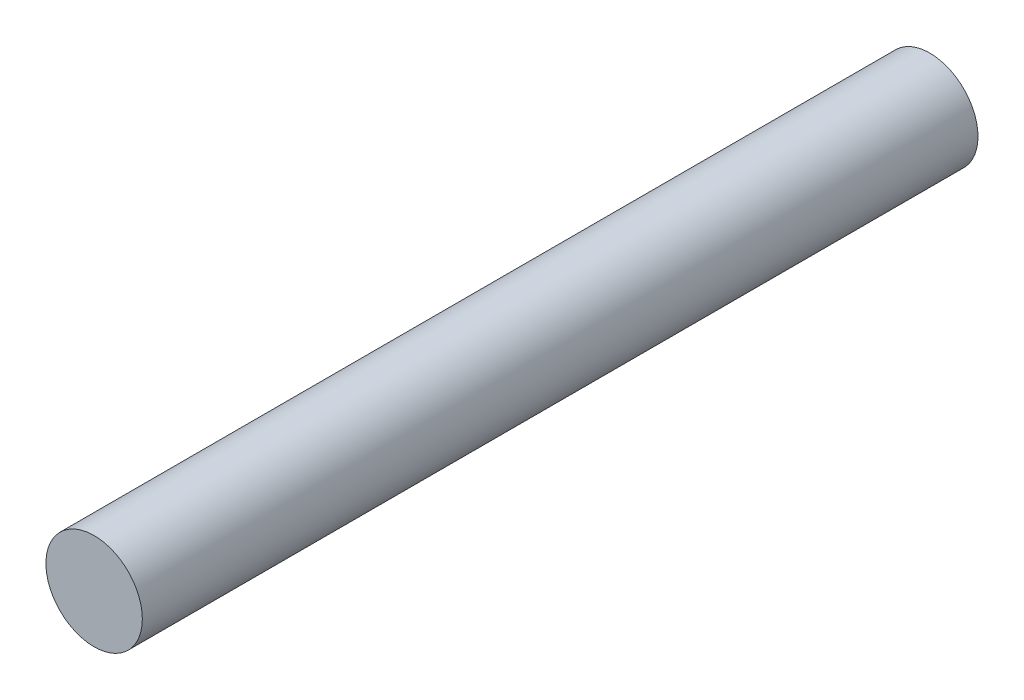
ISO-10303-21;
HEADER;
FILE_DESCRIPTION(('STEP AP214'),'2;1');
FILE_NAME('part.step','',(''),(''),'','','');
FILE_SCHEMA(('AUTOMOTIVE_DESIGN { 1 0 10303 214 1 1 1 1 }'));
ENDSEC;
DATA;
#1=APPLICATION_CONTEXT('core data for automotive mechanical design processes');
#2=APPLICATION_PROTOCOL_DEFINITION('international standard','automotive_design',2000,#1);
#3=PRODUCT_CONTEXT('',#1,'mechanical');
#4=PRODUCT('Part','Part','',(#3));
#5=PRODUCT_RELATED_PRODUCT_CATEGORY('part','',(#4));
#6=PRODUCT_DEFINITION_FORMATION('','',#4);
#7=PRODUCT_DEFINITION_CONTEXT('part definition',#1,'design');
#8=PRODUCT_DEFINITION('design','',#6,#7);
#9=PRODUCT_DEFINITION_SHAPE('','',#8);
#10=(LENGTH_UNIT() NAMED_UNIT(*) SI_UNIT(.MILLI.,.METRE.));
#11=(NAMED_UNIT(*) PLANE_ANGLE_UNIT() SI_UNIT($,.RADIAN.));
#12=(NAMED_UNIT(*) SI_UNIT($,.STERADIAN.) SOLID_ANGLE_UNIT());
#13=UNCERTAINTY_MEASURE_WITH_UNIT(LENGTH_MEASURE(1.E-05),#10,'distance_accuracy_value','');
#14=(GEOMETRIC_REPRESENTATION_CONTEXT(3) GLOBAL_UNCERTAINTY_ASSIGNED_CONTEXT((#13)) GLOBAL_UNIT_ASSIGNED_CONTEXT((#10,
#11,#12)) REPRESENTATION_CONTEXT('',''));
#15=CARTESIAN_POINT('',(0.,0.,0.));
#16=DIRECTION('',(0.,0.,1.));
#17=DIRECTION('',(1.,0.,0.));
#18=AXIS2_PLACEMENT_3D('',#15,#16,#17);
#19=CARTESIAN_POINT('',(0.,0.,52.));
#20=DIRECTION('',(0.,0.,-1.));
#21=DIRECTION('',(-1.,0.,0.));
#22=AXIS2_PLACEMENT_3D('',#19,#20,#21);
#23=CYLINDRICAL_SURFACE('',#22,3.);
#24=CARTESIAN_POINT('',(0.,0.,52.));
#25=DIRECTION('',(0.,0.,1.));
#26=DIRECTION('',(1.,0.,0.));
#27=AXIS2_PLACEMENT_3D('',#24,#25,#26);
#28=CIRCLE('',#27,3.);
#29=CARTESIAN_POINT('',(3.,0.,52.));
#30=VERTEX_POINT('',#29);
#31=EDGE_CURVE('E10',#30,#30,#28,.T.);
#32=ORIENTED_EDGE('',*,*,#31,.F.);
#33=EDGE_LOOP('',(#32));
#34=FACE_BOUND('',#33,.T.);
#35=CARTESIAN_POINT('',(0.,0.,0.));
#36=DIRECTION('',(0.,0.,1.));
#37=DIRECTION('',(1.,0.,0.));
#38=AXIS2_PLACEMENT_3D('',#35,#36,#37);
#39=CIRCLE('',#38,3.);
#40=CARTESIAN_POINT('',(3.,0.,0.));
#41=VERTEX_POINT('',#40);
#42=EDGE_CURVE('E45',#41,#41,#39,.T.);
#43=ORIENTED_EDGE('',*,*,#42,.T.);
#44=EDGE_LOOP('',(#43));
#45=FACE_BOUND('',#44,.T.);
#46=ADVANCED_FACE('F39',(#34,#45),#23,.T.);
#47=CARTESIAN_POINT('',(0.,0.,52.));
#48=DIRECTION('',(0.,0.,1.));
#49=DIRECTION('',(1.,0.,0.));
#50=AXIS2_PLACEMENT_3D('',#47,#48,#49);
#51=PLANE('',#50);
#52=ORIENTED_EDGE('',*,*,#31,.T.);
#53=EDGE_LOOP('',(#52));
#54=FACE_BOUND('',#53,.T.);
#55=ADVANCED_FACE('F53',(#54),#51,.T.);
#56=CARTESIAN_POINT('',(0.,0.,0.));
#57=DIRECTION('',(0.,0.,1.));
#58=DIRECTION('',(1.,0.,0.));
#59=AXIS2_PLACEMENT_3D('',#56,#57,#58);
#60=PLANE('',#59);
#61=ORIENTED_EDGE('',*,*,#42,.F.);
#62=EDGE_LOOP('',(#61));
#63=FACE_BOUND('',#62,.T.);
#64=ADVANCED_FACE('F55',(#63),#60,.F.);
#65=CLOSED_SHELL('',(#46,#55,#64));
#66=MANIFOLD_SOLID_BREP('B2',#65);
#67=ADVANCED_BREP_SHAPE_REPRESENTATION('',(#18,#66),#14);
#68=SHAPE_DEFINITION_REPRESENTATION(#9,#67);
ENDSEC;
END-ISO-10303-21;
